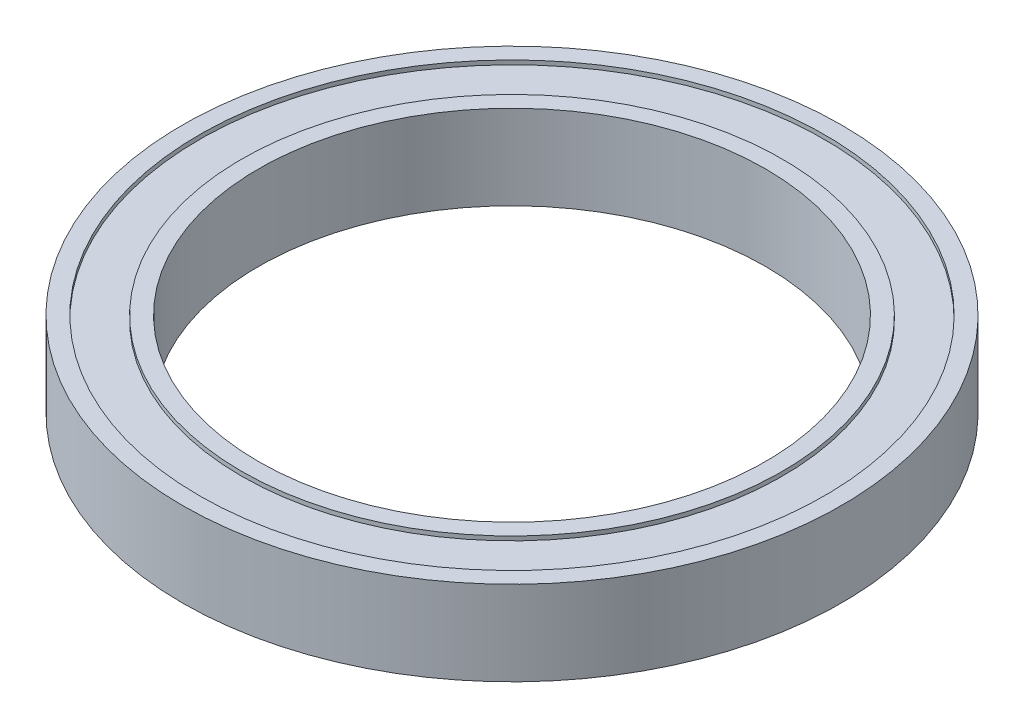
ISO-10303-21;
HEADER;
FILE_DESCRIPTION(('STEP AP214'),'2;1');
FILE_NAME('part.step','',(''),(''),'','','');
FILE_SCHEMA(('AUTOMOTIVE_DESIGN { 1 0 10303 214 1 1 1 1 }'));
ENDSEC;
DATA;
#1=APPLICATION_CONTEXT('core data for automotive mechanical design processes');
#2=APPLICATION_PROTOCOL_DEFINITION('international standard','automotive_design',2000,#1);
#3=PRODUCT_CONTEXT('',#1,'mechanical');
#4=PRODUCT('Part','Part','',(#3));
#5=PRODUCT_RELATED_PRODUCT_CATEGORY('part','',(#4));
#6=PRODUCT_DEFINITION_FORMATION('','',#4);
#7=PRODUCT_DEFINITION_CONTEXT('part definition',#1,'design');
#8=PRODUCT_DEFINITION('design','',#6,#7);
#9=PRODUCT_DEFINITION_SHAPE('','',#8);
#10=(LENGTH_UNIT() NAMED_UNIT(*) SI_UNIT(.MILLI.,.METRE.));
#11=(NAMED_UNIT(*) PLANE_ANGLE_UNIT() SI_UNIT($,.RADIAN.));
#12=(NAMED_UNIT(*) SI_UNIT($,.STERADIAN.) SOLID_ANGLE_UNIT());
#13=UNCERTAINTY_MEASURE_WITH_UNIT(LENGTH_MEASURE(1.E-05),#10,'distance_accuracy_value','');
#14=(GEOMETRIC_REPRESENTATION_CONTEXT(3) GLOBAL_UNCERTAINTY_ASSIGNED_CONTEXT((#13)) GLOBAL_UNIT_ASSIGNED_CONTEXT((#10,
#11,#12)) REPRESENTATION_CONTEXT('',''));
#15=CARTESIAN_POINT('',(0.,0.,0.));
#16=DIRECTION('',(0.,0.,1.));
#17=DIRECTION('',(1.,0.,0.));
#18=AXIS2_PLACEMENT_3D('',#15,#16,#17);
#19=CARTESIAN_POINT('',(0.,0.,0.));
#20=DIRECTION('',(0.,1.,0.));
#21=DIRECTION('',(0.,0.,1.));
#22=AXIS2_PLACEMENT_3D('',#19,#20,#21);
#23=PLANE('',#22);
#24=CARTESIAN_POINT('',(0.,0.,0.));
#25=DIRECTION('',(0.,1.,0.));
#26=DIRECTION('',(0.,0.,1.));
#27=AXIS2_PLACEMENT_3D('',#24,#25,#26);
#28=CIRCLE('',#27,30.);
#29=CARTESIAN_POINT('',(0.,0.,30.));
#30=VERTEX_POINT('',#29);
#31=EDGE_CURVE('E44',#30,#30,#28,.T.);
#32=ORIENTED_EDGE('',*,*,#31,.T.);
#33=EDGE_LOOP('',(#32));
#34=FACE_BOUND('',#33,.T.);
#35=CARTESIAN_POINT('',(0.,0.,0.));
#36=DIRECTION('',(0.,-1.,0.));
#37=DIRECTION('',(0.,0.,-1.));
#38=AXIS2_PLACEMENT_3D('',#35,#36,#37);
#39=CIRCLE('',#38,32.);
#40=CARTESIAN_POINT('',(0.,0.,-32.));
#41=VERTEX_POINT('',#40);
#42=EDGE_CURVE('E68',#41,#41,#39,.T.);
#43=ORIENTED_EDGE('',*,*,#42,.T.);
#44=EDGE_LOOP('',(#43));
#45=FACE_BOUND('',#44,.T.);
#46=ADVANCED_FACE('F31',(#34,#45),#23,.F.);
#47=CARTESIAN_POINT('',(0.,10.,0.));
#48=DIRECTION('',(0.,1.,0.));
#49=DIRECTION('',(0.,0.,1.));
#50=AXIS2_PLACEMENT_3D('',#47,#48,#49);
#51=PLANE('',#50);
#52=CARTESIAN_POINT('',(0.,10.,0.));
#53=DIRECTION('',(0.,1.,0.));
#54=DIRECTION('',(0.,0.,1.));
#55=AXIS2_PLACEMENT_3D('',#52,#53,#54);
#56=CIRCLE('',#55,30.);
#57=CARTESIAN_POINT('',(0.,10.,30.));
#58=VERTEX_POINT('',#57);
#59=EDGE_CURVE('E42',#58,#58,#56,.T.);
#60=ORIENTED_EDGE('',*,*,#59,.F.);
#61=EDGE_LOOP('',(#60));
#62=FACE_BOUND('',#61,.T.);
#63=CARTESIAN_POINT('',(0.,10.,0.));
#64=DIRECTION('',(0.,1.,0.));
#65=DIRECTION('',(0.,0.,1.));
#66=AXIS2_PLACEMENT_3D('',#63,#64,#65);
#67=CIRCLE('',#66,32.);
#68=CARTESIAN_POINT('',(0.,10.,32.));
#69=VERTEX_POINT('',#68);
#70=EDGE_CURVE('E56',#69,#69,#67,.T.);
#71=ORIENTED_EDGE('',*,*,#70,.T.);
#72=EDGE_LOOP('',(#71));
#73=FACE_BOUND('',#72,.T.);
#74=ADVANCED_FACE('F107',(#62,#73),#51,.T.);
#75=CARTESIAN_POINT('',(0.,10.,0.));
#76=DIRECTION('',(0.,1.,0.));
#77=DIRECTION('',(0.,0.,1.));
#78=AXIS2_PLACEMENT_3D('',#75,#76,#77);
#79=CIRCLE('',#78,37.);
#80=CARTESIAN_POINT('',(0.,10.,37.));
#81=VERTEX_POINT('',#80);
#82=EDGE_CURVE('E50',#81,#81,#79,.T.);
#83=ORIENTED_EDGE('',*,*,#82,.F.);
#84=EDGE_LOOP('',(#83));
#85=FACE_BOUND('',#84,.T.);
#86=CARTESIAN_POINT('',(0.,10.,0.));
#87=DIRECTION('',(0.,1.,0.));
#88=DIRECTION('',(0.,0.,1.));
#89=AXIS2_PLACEMENT_3D('',#86,#87,#88);
#90=CIRCLE('',#89,39.);
#91=CARTESIAN_POINT('',(0.,10.,39.));
#92=VERTEX_POINT('',#91);
#93=EDGE_CURVE('E10',#92,#92,#90,.T.);
#94=ORIENTED_EDGE('',*,*,#93,.T.);
#95=EDGE_LOOP('',(#94));
#96=FACE_BOUND('',#95,.T.);
#97=ADVANCED_FACE('F93',(#85,#96),#51,.T.);
#98=CARTESIAN_POINT('',(0.,0.,0.));
#99=DIRECTION('',(0.,-1.,0.));
#100=DIRECTION('',(0.,0.,-1.));
#101=AXIS2_PLACEMENT_3D('',#98,#99,#100);
#102=CIRCLE('',#101,37.);
#103=CARTESIAN_POINT('',(0.,0.,-37.));
#104=VERTEX_POINT('',#103);
#105=EDGE_CURVE('E62',#104,#104,#102,.T.);
#106=ORIENTED_EDGE('',*,*,#105,.F.);
#107=EDGE_LOOP('',(#106));
#108=FACE_BOUND('',#107,.T.);
#109=CARTESIAN_POINT('',(0.,0.,0.));
#110=DIRECTION('',(0.,1.,0.));
#111=DIRECTION('',(0.,0.,1.));
#112=AXIS2_PLACEMENT_3D('',#109,#110,#111);
#113=CIRCLE('',#112,39.);
#114=CARTESIAN_POINT('',(0.,0.,39.));
#115=VERTEX_POINT('',#114);
#116=EDGE_CURVE('E35',#115,#115,#113,.T.);
#117=ORIENTED_EDGE('',*,*,#116,.F.);
#118=EDGE_LOOP('',(#117));
#119=FACE_BOUND('',#118,.T.);
#120=ADVANCED_FACE('F90',(#108,#119),#23,.F.);
#121=CARTESIAN_POINT('',(0.,10.,0.));
#122=DIRECTION('',(0.,-1.,0.));
#123=DIRECTION('',(0.,0.,-1.));
#124=AXIS2_PLACEMENT_3D('',#121,#122,#123);
#125=CYLINDRICAL_SURFACE('',#124,39.);
#126=ORIENTED_EDGE('',*,*,#93,.F.);
#127=EDGE_LOOP('',(#126));
#128=FACE_BOUND('',#127,.T.);
#129=ORIENTED_EDGE('',*,*,#116,.T.);
#130=EDGE_LOOP('',(#129));
#131=FACE_BOUND('',#130,.T.);
#132=ADVANCED_FACE('F33',(#128,#131),#125,.T.);
#133=CARTESIAN_POINT('',(0.,10.,0.));
#134=DIRECTION('',(0.,-1.,0.));
#135=DIRECTION('',(0.,0.,-1.));
#136=AXIS2_PLACEMENT_3D('',#133,#134,#135);
#137=CYLINDRICAL_SURFACE('',#136,30.);
#138=ORIENTED_EDGE('',*,*,#59,.T.);
#139=EDGE_LOOP('',(#138));
#140=FACE_BOUND('',#139,.T.);
#141=ORIENTED_EDGE('',*,*,#31,.F.);
#142=EDGE_LOOP('',(#141));
#143=FACE_BOUND('',#142,.T.);
#144=ADVANCED_FACE('F97',(#140,#143),#137,.F.);
#145=CARTESIAN_POINT('',(0.,9.5,0.));
#146=DIRECTION('',(0.,1.,0.));
#147=DIRECTION('',(0.,0.,1.));
#148=AXIS2_PLACEMENT_3D('',#145,#146,#147);
#149=CYLINDRICAL_SURFACE('',#148,37.);
#150=CARTESIAN_POINT('',(0.,9.5,0.));
#151=DIRECTION('',(0.,1.,0.));
#152=DIRECTION('',(0.,0.,1.));
#153=AXIS2_PLACEMENT_3D('',#150,#151,#152);
#154=CIRCLE('',#153,37.);
#155=CARTESIAN_POINT('',(0.,9.5,37.));
#156=VERTEX_POINT('',#155);
#157=EDGE_CURVE('E47',#156,#156,#154,.T.);
#158=ORIENTED_EDGE('',*,*,#157,.F.);
#159=EDGE_LOOP('',(#158));
#160=FACE_BOUND('',#159,.T.);
#161=ORIENTED_EDGE('',*,*,#82,.T.);
#162=EDGE_LOOP('',(#161));
#163=FACE_BOUND('',#162,.T.);
#164=ADVANCED_FACE('F103',(#160,#163),#149,.F.);
#165=CARTESIAN_POINT('',(0.,9.5,0.));
#166=DIRECTION('',(0.,1.,0.));
#167=DIRECTION('',(0.,0.,1.));
#168=AXIS2_PLACEMENT_3D('',#165,#166,#167);
#169=PLANE('',#168);
#170=CARTESIAN_POINT('',(0.,9.5,0.));
#171=DIRECTION('',(0.,1.,0.));
#172=DIRECTION('',(0.,0.,1.));
#173=AXIS2_PLACEMENT_3D('',#170,#171,#172);
#174=CIRCLE('',#173,32.);
#175=CARTESIAN_POINT('',(0.,9.5,32.));
#176=VERTEX_POINT('',#175);
#177=EDGE_CURVE('E53',#176,#176,#174,.T.);
#178=ORIENTED_EDGE('',*,*,#177,.F.);
#179=EDGE_LOOP('',(#178));
#180=FACE_BOUND('',#179,.T.);
#181=ORIENTED_EDGE('',*,*,#157,.T.);
#182=EDGE_LOOP('',(#181));
#183=FACE_BOUND('',#182,.T.);
#184=ADVANCED_FACE('F121',(#180,#183),#169,.T.);
#185=CARTESIAN_POINT('',(0.,9.5,0.));
#186=DIRECTION('',(0.,1.,0.));
#187=DIRECTION('',(0.,0.,1.));
#188=AXIS2_PLACEMENT_3D('',#185,#186,#187);
#189=CYLINDRICAL_SURFACE('',#188,32.);
#190=ORIENTED_EDGE('',*,*,#177,.T.);
#191=EDGE_LOOP('',(#190));
#192=FACE_BOUND('',#191,.T.);
#193=ORIENTED_EDGE('',*,*,#70,.F.);
#194=EDGE_LOOP('',(#193));
#195=FACE_BOUND('',#194,.T.);
#196=ADVANCED_FACE('F86',(#192,#195),#189,.T.);
#197=CARTESIAN_POINT('',(0.,0.5,0.));
#198=DIRECTION('',(0.,-1.,0.));
#199=DIRECTION('',(0.,0.,-1.));
#200=AXIS2_PLACEMENT_3D('',#197,#198,#199);
#201=CYLINDRICAL_SURFACE('',#200,37.);
#202=CARTESIAN_POINT('',(0.,0.5,0.));
#203=DIRECTION('',(0.,-1.,0.));
#204=DIRECTION('',(0.,0.,-1.));
#205=AXIS2_PLACEMENT_3D('',#202,#203,#204);
#206=CIRCLE('',#205,37.);
#207=CARTESIAN_POINT('',(0.,0.5,-37.));
#208=VERTEX_POINT('',#207);
#209=EDGE_CURVE('E59',#208,#208,#206,.T.);
#210=ORIENTED_EDGE('',*,*,#209,.F.);
#211=EDGE_LOOP('',(#210));
#212=FACE_BOUND('',#211,.T.);
#213=ORIENTED_EDGE('',*,*,#105,.T.);
#214=EDGE_LOOP('',(#213));
#215=FACE_BOUND('',#214,.T.);
#216=ADVANCED_FACE('F80',(#212,#215),#201,.F.);
#217=CARTESIAN_POINT('',(0.,0.5,0.));
#218=DIRECTION('',(0.,-1.,0.));
#219=DIRECTION('',(0.,0.,-1.));
#220=AXIS2_PLACEMENT_3D('',#217,#218,#219);
#221=PLANE('',#220);
#222=CARTESIAN_POINT('',(0.,0.5,0.));
#223=DIRECTION('',(0.,-1.,0.));
#224=DIRECTION('',(0.,0.,-1.));
#225=AXIS2_PLACEMENT_3D('',#222,#223,#224);
#226=CIRCLE('',#225,32.);
#227=CARTESIAN_POINT('',(0.,0.5,-32.));
#228=VERTEX_POINT('',#227);
#229=EDGE_CURVE('E65',#228,#228,#226,.T.);
#230=ORIENTED_EDGE('',*,*,#229,.F.);
#231=EDGE_LOOP('',(#230));
#232=FACE_BOUND('',#231,.T.);
#233=ORIENTED_EDGE('',*,*,#209,.T.);
#234=EDGE_LOOP('',(#233));
#235=FACE_BOUND('',#234,.T.);
#236=ADVANCED_FACE('F77',(#232,#235),#221,.T.);
#237=CARTESIAN_POINT('',(0.,0.5,0.));
#238=DIRECTION('',(0.,-1.,0.));
#239=DIRECTION('',(0.,0.,-1.));
#240=AXIS2_PLACEMENT_3D('',#237,#238,#239);
#241=CYLINDRICAL_SURFACE('',#240,32.);
#242=ORIENTED_EDGE('',*,*,#229,.T.);
#243=EDGE_LOOP('',(#242));
#244=FACE_BOUND('',#243,.T.);
#245=ORIENTED_EDGE('',*,*,#42,.F.);
#246=EDGE_LOOP('',(#245));
#247=FACE_BOUND('',#246,.T.);
#248=ADVANCED_FACE('F74',(#244,#247),#241,.T.);
#249=CLOSED_SHELL('',(#46,#74,#97,#120,#132,#144,#164,#184,#196,#216,#236,#248));
#250=MANIFOLD_SOLID_BREP('B2',#249);
#251=ADVANCED_BREP_SHAPE_REPRESENTATION('',(#18,#250),#14);
#252=SHAPE_DEFINITION_REPRESENTATION(#9,#251);
ENDSEC;
END-ISO-10303-21;
